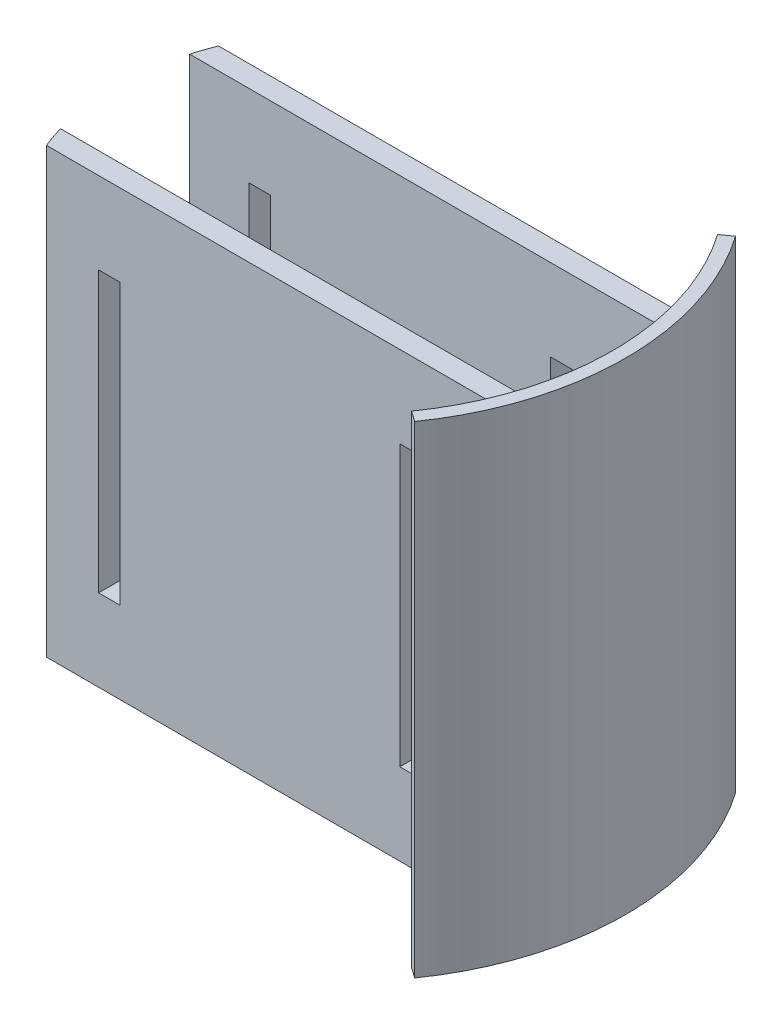
ISO-10303-21;
HEADER;
FILE_DESCRIPTION(('STEP AP214'),'2;1');
FILE_NAME('part.step','',(''),(''),'','','');
FILE_SCHEMA(('AUTOMOTIVE_DESIGN { 1 0 10303 214 1 1 1 1 }'));
ENDSEC;
DATA;
#1=APPLICATION_CONTEXT('core data for automotive mechanical design processes');
#2=APPLICATION_PROTOCOL_DEFINITION('international standard','automotive_design',2000,#1);
#3=PRODUCT_CONTEXT('',#1,'mechanical');
#4=PRODUCT('Part','Part','',(#3));
#5=PRODUCT_RELATED_PRODUCT_CATEGORY('part','',(#4));
#6=PRODUCT_DEFINITION_FORMATION('','',#4);
#7=PRODUCT_DEFINITION_CONTEXT('part definition',#1,'design');
#8=PRODUCT_DEFINITION('design','',#6,#7);
#9=PRODUCT_DEFINITION_SHAPE('','',#8);
#10=(LENGTH_UNIT() NAMED_UNIT(*) SI_UNIT(.MILLI.,.METRE.));
#11=(NAMED_UNIT(*) PLANE_ANGLE_UNIT() SI_UNIT($,.RADIAN.));
#12=(NAMED_UNIT(*) SI_UNIT($,.STERADIAN.) SOLID_ANGLE_UNIT());
#13=UNCERTAINTY_MEASURE_WITH_UNIT(LENGTH_MEASURE(1.E-05),#10,'distance_accuracy_value','');
#14=(GEOMETRIC_REPRESENTATION_CONTEXT(3) GLOBAL_UNCERTAINTY_ASSIGNED_CONTEXT((#13)) GLOBAL_UNIT_ASSIGNED_CONTEXT((#10,
#11,#12)) REPRESENTATION_CONTEXT('',''));
#15=CARTESIAN_POINT('',(0.,0.,0.));
#16=DIRECTION('',(0.,0.,1.));
#17=DIRECTION('',(1.,0.,0.));
#18=AXIS2_PLACEMENT_3D('',#15,#16,#17);
#19=CARTESIAN_POINT('',(0.,56.,0.));
#20=DIRECTION('',(0.,-1.,0.));
#21=DIRECTION('',(0.,0.,-1.));
#22=AXIS2_PLACEMENT_3D('',#19,#20,#21);
#23=CYLINDRICAL_SURFACE('',#22,62.);
#24=CARTESIAN_POINT('',(0.,-56.,0.));
#25=DIRECTION('',(0.,-1.,0.));
#26=DIRECTION('',(0.,0.,1.));
#27=AXIS2_PLACEMENT_3D('',#24,#25,#26);
#28=CIRCLE('',#27,62.);
#29=CARTESIAN_POINT('',(50.7874267459174,-56.,-35.561739053765));
#30=VERTEX_POINT('',#29);
#31=CARTESIAN_POINT('',(50.7874267459174,-56.,35.561739053765));
#32=VERTEX_POINT('',#31);
#33=EDGE_CURVE('E387',#30,#32,#28,.T.);
#34=ORIENTED_EDGE('',*,*,#33,.T.);
#35=DIRECTION('',(0.,-1.,0.));
#36=VECTOR('',#35,1.);
#37=CARTESIAN_POINT('',(50.7874267459174,56.,35.561739053765));
#38=LINE('',#37,#36);
#39=CARTESIAN_POINT('',(50.7874267459174,56.,35.561739053765));
#40=VERTEX_POINT('',#39);
#41=EDGE_CURVE('E414',#40,#32,#38,.T.);
#42=ORIENTED_EDGE('',*,*,#41,.F.);
#43=CARTESIAN_POINT('',(0.,56.,0.));
#44=DIRECTION('',(0.,-1.,0.));
#45=DIRECTION('',(0.,0.,1.));
#46=AXIS2_PLACEMENT_3D('',#43,#44,#45);
#47=CIRCLE('',#46,62.);
#48=CARTESIAN_POINT('',(50.7874267459174,56.,-35.561739053765));
#49=VERTEX_POINT('',#48);
#50=EDGE_CURVE('E388',#49,#40,#47,.T.);
#51=ORIENTED_EDGE('',*,*,#50,.F.);
#52=DIRECTION('',(0.,-1.,0.));
#53=VECTOR('',#52,1.);
#54=CARTESIAN_POINT('',(50.7874267459174,56.,-35.561739053765));
#55=LINE('',#54,#53);
#56=EDGE_CURVE('E398',#49,#30,#55,.T.);
#57=ORIENTED_EDGE('',*,*,#56,.T.);
#58=EDGE_LOOP('',(#34,#42,#51,#57));
#59=FACE_BOUND('',#58,.T.);
#60=DIRECTION('',(0.,-1.,0.));
#61=VECTOR('',#60,1.);
#62=CARTESIAN_POINT('',(58.6856030044848,51.5,-20.));
#63=LINE('',#62,#61);
#64=CARTESIAN_POINT('',(58.6856030044848,51.5,-20.));
#65=VERTEX_POINT('',#64);
#66=CARTESIAN_POINT('',(58.6856030044848,-51.5,-20.));
#67=VERTEX_POINT('',#66);
#68=EDGE_CURVE('E379',#65,#67,#63,.T.);
#69=ORIENTED_EDGE('',*,*,#68,.F.);
#70=CARTESIAN_POINT('',(0.,51.5,0.));
#71=DIRECTION('',(0.,1.,0.));
#72=DIRECTION('',(0.,0.,1.));
#73=AXIS2_PLACEMENT_3D('',#70,#71,#72);
#74=CIRCLE('',#73,62.);
#75=CARTESIAN_POINT('',(60.1581249707801,51.5,-15.));
#76=VERTEX_POINT('',#75);
#77=EDGE_CURVE('E363',#76,#65,#74,.T.);
#78=ORIENTED_EDGE('',*,*,#77,.F.);
#79=DIRECTION('',(0.,-1.,0.));
#80=VECTOR('',#79,1.);
#81=CARTESIAN_POINT('',(60.1581249707801,51.5,-15.));
#82=LINE('',#81,#80);
#83=CARTESIAN_POINT('',(60.1581249707801,-51.5,-15.));
#84=VERTEX_POINT('',#83);
#85=EDGE_CURVE('E382',#76,#84,#82,.T.);
#86=ORIENTED_EDGE('',*,*,#85,.T.);
#87=CARTESIAN_POINT('',(0.,-51.5,0.));
#88=DIRECTION('',(0.,1.,0.));
#89=DIRECTION('',(0.,0.,1.));
#90=AXIS2_PLACEMENT_3D('',#87,#88,#89);
#91=CIRCLE('',#90,62.);
#92=EDGE_CURVE('E374',#84,#67,#91,.T.);
#93=ORIENTED_EDGE('',*,*,#92,.T.);
#94=EDGE_LOOP('',(#69,#78,#86,#93));
#95=FACE_BOUND('',#94,.T.);
#96=CARTESIAN_POINT('',(0.,51.5,0.));
#97=DIRECTION('',(0.,1.,0.));
#98=DIRECTION('',(0.,0.,1.));
#99=AXIS2_PLACEMENT_3D('',#96,#97,#98);
#100=CIRCLE('',#99,62.);
#101=CARTESIAN_POINT('',(58.6856030044848,51.5,20.));
#102=VERTEX_POINT('',#101);
#103=CARTESIAN_POINT('',(60.1581249707801,51.5,15.));
#104=VERTEX_POINT('',#103);
#105=EDGE_CURVE('E350',#102,#104,#100,.T.);
#106=ORIENTED_EDGE('',*,*,#105,.F.);
#107=DIRECTION('',(0.,-1.,0.));
#108=VECTOR('',#107,1.);
#109=CARTESIAN_POINT('',(58.6856030044848,51.5,20.));
#110=LINE('',#109,#108);
#111=CARTESIAN_POINT('',(58.6856030044848,-51.5,20.));
#112=VERTEX_POINT('',#111);
#113=EDGE_CURVE('E327',#102,#112,#110,.T.);
#114=ORIENTED_EDGE('',*,*,#113,.T.);
#115=CARTESIAN_POINT('',(0.,-51.5,0.));
#116=DIRECTION('',(0.,1.,0.));
#117=DIRECTION('',(0.,0.,1.));
#118=AXIS2_PLACEMENT_3D('',#115,#116,#117);
#119=CIRCLE('',#118,62.);
#120=CARTESIAN_POINT('',(60.1581249707801,-51.5,15.));
#121=VERTEX_POINT('',#120);
#122=EDGE_CURVE('E339',#112,#121,#119,.T.);
#123=ORIENTED_EDGE('',*,*,#122,.T.);
#124=DIRECTION('',(0.,-1.,0.));
#125=VECTOR('',#124,1.);
#126=CARTESIAN_POINT('',(60.1581249707801,51.5,15.));
#127=LINE('',#126,#125);
#128=EDGE_CURVE('E330',#104,#121,#127,.T.);
#129=ORIENTED_EDGE('',*,*,#128,.F.);
#130=EDGE_LOOP('',(#106,#114,#123,#129));
#131=FACE_BOUND('',#130,.T.);
#132=ADVANCED_FACE('F37',(#59,#95,#131),#23,.F.);
#133=CARTESIAN_POINT('',(50.7874267459174,56.,35.561739053765));
#134=DIRECTION('',(0.573576436351047,0.,-0.819152044288991));
#135=DIRECTION('',(-0.819152044288991,0.,-0.573576436351047));
#136=AXIS2_PLACEMENT_3D('',#133,#134,#135);
#137=PLANE('',#136);
#138=DIRECTION('',(0.819152044288991,0.,0.573576436351047));
#139=VECTOR('',#138,1.);
#140=CARTESIAN_POINT('',(50.7874267459174,-56.,35.561739053765));
#141=LINE('',#140,#139);
#142=CARTESIAN_POINT('',(53.2448828787844,-56.,37.2824683628181));
#143=VERTEX_POINT('',#142);
#144=EDGE_CURVE('E401',#32,#143,#141,.T.);
#145=ORIENTED_EDGE('',*,*,#144,.T.);
#146=DIRECTION('',(0.,-1.,0.));
#147=VECTOR('',#146,1.);
#148=CARTESIAN_POINT('',(53.2448828787844,56.,37.2824683628181));
#149=LINE('',#148,#147);
#150=CARTESIAN_POINT('',(53.2448828787844,56.,37.2824683628181));
#151=VERTEX_POINT('',#150);
#152=EDGE_CURVE('E411',#151,#143,#149,.T.);
#153=ORIENTED_EDGE('',*,*,#152,.F.);
#154=DIRECTION('',(0.819152044288991,0.,0.573576436351047));
#155=VECTOR('',#154,1.);
#156=CARTESIAN_POINT('',(50.7874267459174,56.,35.561739053765));
#157=LINE('',#156,#155);
#158=EDGE_CURVE('E391',#40,#151,#157,.T.);
#159=ORIENTED_EDGE('',*,*,#158,.F.);
#160=ORIENTED_EDGE('',*,*,#41,.T.);
#161=EDGE_LOOP('',(#145,#153,#159,#160));
#162=FACE_BOUND('',#161,.T.);
#163=ADVANCED_FACE('F475',(#162),#137,.F.);
#164=CARTESIAN_POINT('',(0.,56.,0.));
#165=DIRECTION('',(0.,-1.,0.));
#166=DIRECTION('',(0.,0.,-1.));
#167=AXIS2_PLACEMENT_3D('',#164,#165,#166);
#168=CYLINDRICAL_SURFACE('',#167,65.);
#169=CARTESIAN_POINT('',(0.,-56.,0.));
#170=DIRECTION('',(0.,1.,0.));
#171=DIRECTION('',(0.,0.,1.));
#172=AXIS2_PLACEMENT_3D('',#169,#170,#171);
#173=CIRCLE('',#172,65.);
#174=CARTESIAN_POINT('',(53.2448828787844,-56.,-37.2824683628181));
#175=VERTEX_POINT('',#174);
#176=EDGE_CURVE('E403',#143,#175,#173,.T.);
#177=ORIENTED_EDGE('',*,*,#176,.T.);
#178=DIRECTION('',(0.,-1.,0.));
#179=VECTOR('',#178,1.);
#180=CARTESIAN_POINT('',(53.2448828787844,56.,-37.2824683628181));
#181=LINE('',#180,#179);
#182=CARTESIAN_POINT('',(53.2448828787844,56.,-37.2824683628181));
#183=VERTEX_POINT('',#182);
#184=EDGE_CURVE('E408',#183,#175,#181,.T.);
#185=ORIENTED_EDGE('',*,*,#184,.F.);
#186=CARTESIAN_POINT('',(0.,56.,0.));
#187=DIRECTION('',(0.,1.,0.));
#188=DIRECTION('',(0.,0.,1.));
#189=AXIS2_PLACEMENT_3D('',#186,#187,#188);
#190=CIRCLE('',#189,65.);
#191=EDGE_CURVE('E394',#151,#183,#190,.T.);
#192=ORIENTED_EDGE('',*,*,#191,.F.);
#193=ORIENTED_EDGE('',*,*,#152,.T.);
#194=EDGE_LOOP('',(#177,#185,#192,#193));
#195=FACE_BOUND('',#194,.T.);
#196=ADVANCED_FACE('F480',(#195),#168,.T.);
#197=CARTESIAN_POINT('',(50.7874267459174,56.,-35.561739053765));
#198=DIRECTION('',(0.573576436351044,0.,0.819152044288993));
#199=DIRECTION('',(0.819152044288993,0.,-0.573576436351044));
#200=AXIS2_PLACEMENT_3D('',#197,#198,#199);
#201=PLANE('',#200);
#202=DIRECTION('',(-0.819152044288993,0.,0.573576436351044));
#203=VECTOR('',#202,1.);
#204=CARTESIAN_POINT('',(50.7874267459174,-56.,-35.561739053765));
#205=LINE('',#204,#203);
#206=EDGE_CURVE('E392',#175,#30,#205,.T.);
#207=ORIENTED_EDGE('',*,*,#206,.T.);
#208=ORIENTED_EDGE('',*,*,#56,.F.);
#209=DIRECTION('',(-0.819152044288993,0.,0.573576436351044));
#210=VECTOR('',#209,1.);
#211=CARTESIAN_POINT('',(50.7874267459174,56.,-35.561739053765));
#212=LINE('',#211,#210);
#213=EDGE_CURVE('E396',#183,#49,#212,.T.);
#214=ORIENTED_EDGE('',*,*,#213,.F.);
#215=ORIENTED_EDGE('',*,*,#184,.T.);
#216=EDGE_LOOP('',(#207,#208,#214,#215));
#217=FACE_BOUND('',#216,.T.);
#218=ADVANCED_FACE('F537',(#217),#201,.F.);
#219=CARTESIAN_POINT('',(0.,56.,0.));
#220=DIRECTION('',(0.,1.,0.));
#221=DIRECTION('',(0.,0.,1.));
#222=AXIS2_PLACEMENT_3D('',#219,#220,#221);
#223=PLANE('',#222);
#224=ORIENTED_EDGE('',*,*,#50,.T.);
#225=ORIENTED_EDGE('',*,*,#158,.T.);
#226=ORIENTED_EDGE('',*,*,#191,.T.);
#227=ORIENTED_EDGE('',*,*,#213,.T.);
#228=EDGE_LOOP('',(#224,#225,#226,#227));
#229=FACE_BOUND('',#228,.T.);
#230=ADVANCED_FACE('F534',(#229),#223,.T.);
#231=CARTESIAN_POINT('',(0.,-56.,0.));
#232=DIRECTION('',(0.,1.,0.));
#233=DIRECTION('',(0.,0.,1.));
#234=AXIS2_PLACEMENT_3D('',#231,#232,#233);
#235=PLANE('',#234);
#236=ORIENTED_EDGE('',*,*,#33,.F.);
#237=ORIENTED_EDGE('',*,*,#206,.F.);
#238=ORIENTED_EDGE('',*,*,#176,.F.);
#239=ORIENTED_EDGE('',*,*,#144,.F.);
#240=EDGE_LOOP('',(#236,#237,#238,#239));
#241=FACE_BOUND('',#240,.T.);
#242=ADVANCED_FACE('F532',(#241),#235,.F.);
#243=CARTESIAN_POINT('',(0.,51.5,0.));
#244=DIRECTION('',(0.,-1.,0.));
#245=DIRECTION('',(0.,0.,-1.));
#246=AXIS2_PLACEMENT_3D('',#243,#244,#245);
#247=CYLINDRICAL_SURFACE('',#246,53.5);
#248=CARTESIAN_POINT('',(0.,-51.5,0.));
#249=DIRECTION('',(0.,1.,0.));
#250=DIRECTION('',(0.,0.,1.));
#251=AXIS2_PLACEMENT_3D('',#248,#249,#250);
#252=CIRCLE('',#251,53.5);
#253=CARTESIAN_POINT('',(-49.6210640756524,-51.5,-20.));
#254=VERTEX_POINT('',#253);
#255=CARTESIAN_POINT('',(-51.3541624408382,-51.5,-15.));
#256=VERTEX_POINT('',#255);
#257=EDGE_CURVE('E348',#254,#256,#252,.T.);
#258=ORIENTED_EDGE('',*,*,#257,.T.);
#259=DIRECTION('',(0.,-1.,0.));
#260=VECTOR('',#259,1.);
#261=CARTESIAN_POINT('',(-51.3541624408382,51.5,-15.));
#262=LINE('',#261,#260);
#263=CARTESIAN_POINT('',(-51.3541624408382,51.5,-15.));
#264=VERTEX_POINT('',#263);
#265=EDGE_CURVE('E384',#264,#256,#262,.T.);
#266=ORIENTED_EDGE('',*,*,#265,.F.);
#267=CARTESIAN_POINT('',(0.,51.5,0.));
#268=DIRECTION('',(0.,1.,0.));
#269=DIRECTION('',(0.,0.,1.));
#270=AXIS2_PLACEMENT_3D('',#267,#268,#269);
#271=CIRCLE('',#270,53.5);
#272=CARTESIAN_POINT('',(-49.6210640756524,51.5,-20.));
#273=VERTEX_POINT('',#272);
#274=EDGE_CURVE('E356',#273,#264,#271,.T.);
#275=ORIENTED_EDGE('',*,*,#274,.F.);
#276=DIRECTION('',(0.,-1.,0.));
#277=VECTOR('',#276,1.);
#278=CARTESIAN_POINT('',(-49.6210640756524,51.5,-20.));
#279=LINE('',#278,#277);
#280=EDGE_CURVE('E368',#273,#254,#279,.T.);
#281=ORIENTED_EDGE('',*,*,#280,.T.);
#282=EDGE_LOOP('',(#258,#266,#275,#281));
#283=FACE_BOUND('',#282,.T.);
#284=ADVANCED_FACE('F529',(#283),#247,.T.);
#285=CARTESIAN_POINT('',(-51.3541624408382,51.5,-15.));
#286=DIRECTION('',(0.,0.,-1.));
#287=DIRECTION('',(-1.,0.,0.));
#288=AXIS2_PLACEMENT_3D('',#285,#286,#287);
#289=PLANE('',#288);
#290=DIRECTION('',(1.,0.,0.));
#291=VECTOR('',#290,1.);
#292=CARTESIAN_POINT('',(-51.3541624408382,32.5,-15.));
#293=LINE('',#292,#291);
#294=CARTESIAN_POINT('',(-37.5,32.5,-15.));
#295=VERTEX_POINT('',#294);
#296=CARTESIAN_POINT('',(-32.5,32.5,-15.));
#297=VERTEX_POINT('',#296);
#298=EDGE_CURVE('E312',#295,#297,#293,.T.);
#299=ORIENTED_EDGE('',*,*,#298,.T.);
#300=DIRECTION('',(0.,-1.,0.));
#301=VECTOR('',#300,1.);
#302=CARTESIAN_POINT('',(-32.5,51.5,-15.));
#303=LINE('',#302,#301);
#304=CARTESIAN_POINT('',(-32.5,-32.5,-15.));
#305=VERTEX_POINT('',#304);
#306=EDGE_CURVE('E321',#297,#305,#303,.T.);
#307=ORIENTED_EDGE('',*,*,#306,.T.);
#308=DIRECTION('',(-1.,0.,0.));
#309=VECTOR('',#308,1.);
#310=CARTESIAN_POINT('',(-51.3541624408384,-32.5,-15.));
#311=LINE('',#310,#309);
#312=CARTESIAN_POINT('',(-37.5,-32.5,-15.));
#313=VERTEX_POINT('',#312);
#314=EDGE_CURVE('E318',#305,#313,#311,.T.);
#315=ORIENTED_EDGE('',*,*,#314,.T.);
#316=DIRECTION('',(0.,1.,0.));
#317=VECTOR('',#316,1.);
#318=CARTESIAN_POINT('',(-37.5,51.5,-15.));
#319=LINE('',#318,#317);
#320=EDGE_CURVE('E315',#313,#295,#319,.T.);
#321=ORIENTED_EDGE('',*,*,#320,.T.);
#322=EDGE_LOOP('',(#299,#307,#315,#321));
#323=FACE_BOUND('',#322,.T.);
#324=DIRECTION('',(1.,0.,0.));
#325=VECTOR('',#324,1.);
#326=CARTESIAN_POINT('',(-51.3541624408382,32.5,-15.));
#327=LINE('',#326,#325);
#328=CARTESIAN_POINT('',(32.5,32.5,-15.));
#329=VERTEX_POINT('',#328);
#330=CARTESIAN_POINT('',(37.5,32.5,-15.));
#331=VERTEX_POINT('',#330);
#332=EDGE_CURVE('E265',#329,#331,#327,.T.);
#333=ORIENTED_EDGE('',*,*,#332,.T.);
#334=DIRECTION('',(0.,-1.,0.));
#335=VECTOR('',#334,1.);
#336=CARTESIAN_POINT('',(37.5,51.5,-15.));
#337=LINE('',#336,#335);
#338=CARTESIAN_POINT('',(37.5,-32.5,-15.));
#339=VERTEX_POINT('',#338);
#340=EDGE_CURVE('E309',#331,#339,#337,.T.);
#341=ORIENTED_EDGE('',*,*,#340,.T.);
#342=DIRECTION('',(-1.,0.,0.));
#343=VECTOR('',#342,1.);
#344=CARTESIAN_POINT('',(-51.3541624408381,-32.5000000000001,-15.));
#345=LINE('',#344,#343);
#346=CARTESIAN_POINT('',(32.5,-32.5,-15.));
#347=VERTEX_POINT('',#346);
#348=EDGE_CURVE('E306',#339,#347,#345,.T.);
#349=ORIENTED_EDGE('',*,*,#348,.T.);
#350=DIRECTION('',(0.,1.,0.));
#351=VECTOR('',#350,1.);
#352=CARTESIAN_POINT('',(32.5,51.5,-15.));
#353=LINE('',#352,#351);
#354=EDGE_CURVE('E303',#347,#329,#353,.T.);
#355=ORIENTED_EDGE('',*,*,#354,.T.);
#356=EDGE_LOOP('',(#333,#341,#349,#355));
#357=FACE_BOUND('',#356,.T.);
#358=DIRECTION('',(1.,0.,0.));
#359=VECTOR('',#358,1.);
#360=CARTESIAN_POINT('',(-51.3541624408382,-51.5,-15.));
#361=LINE('',#360,#359);
#362=EDGE_CURVE('E371',#256,#84,#361,.T.);
#363=ORIENTED_EDGE('',*,*,#362,.T.);
#364=ORIENTED_EDGE('',*,*,#85,.F.);
#365=DIRECTION('',(1.,0.,0.));
#366=VECTOR('',#365,1.);
#367=CARTESIAN_POINT('',(-51.3541624408382,51.5,-15.));
#368=LINE('',#367,#366);
#369=EDGE_CURVE('E359',#264,#76,#368,.T.);
#370=ORIENTED_EDGE('',*,*,#369,.F.);
#371=ORIENTED_EDGE('',*,*,#265,.T.);
#372=EDGE_LOOP('',(#363,#364,#370,#371));
#373=FACE_BOUND('',#372,.T.);
#374=ADVANCED_FACE('F460',(#323,#357,#373),#289,.F.);
#375=CARTESIAN_POINT('',(-49.6210640756524,51.5,-20.));
#376=DIRECTION('',(0.,0.,1.));
#377=DIRECTION('',(1.,0.,0.));
#378=AXIS2_PLACEMENT_3D('',#375,#376,#377);
#379=PLANE('',#378);
#380=DIRECTION('',(-1.,0.,0.));
#381=VECTOR('',#380,1.);
#382=CARTESIAN_POINT('',(-37.5,-32.5,-20.));
#383=LINE('',#382,#381);
#384=CARTESIAN_POINT('',(-32.5,-32.5,-20.));
#385=VERTEX_POINT('',#384);
#386=CARTESIAN_POINT('',(-37.5,-32.5,-20.));
#387=VERTEX_POINT('',#386);
#388=EDGE_CURVE('E442',#385,#387,#383,.T.);
#389=ORIENTED_EDGE('',*,*,#388,.F.);
#390=DIRECTION('',(0.,-1.,0.));
#391=VECTOR('',#390,1.);
#392=CARTESIAN_POINT('',(-32.5,-32.5,-20.));
#393=LINE('',#392,#391);
#394=CARTESIAN_POINT('',(-32.5,32.5,-20.));
#395=VERTEX_POINT('',#394);
#396=EDGE_CURVE('E266',#395,#385,#393,.T.);
#397=ORIENTED_EDGE('',*,*,#396,.F.);
#398=DIRECTION('',(1.,0.,0.));
#399=VECTOR('',#398,1.);
#400=CARTESIAN_POINT('',(-37.5,32.5,-20.));
#401=LINE('',#400,#399);
#402=CARTESIAN_POINT('',(-37.5,32.5,-20.));
#403=VERTEX_POINT('',#402);
#404=EDGE_CURVE('E263',#403,#395,#401,.T.);
#405=ORIENTED_EDGE('',*,*,#404,.F.);
#406=DIRECTION('',(0.,1.,0.));
#407=VECTOR('',#406,1.);
#408=CARTESIAN_POINT('',(-37.5,-32.5,-20.));
#409=LINE('',#408,#407);
#410=EDGE_CURVE('E255',#387,#403,#409,.T.);
#411=ORIENTED_EDGE('',*,*,#410,.F.);
#412=EDGE_LOOP('',(#389,#397,#405,#411));
#413=FACE_BOUND('',#412,.T.);
#414=DIRECTION('',(-1.,0.,0.));
#415=VECTOR('',#414,1.);
#416=CARTESIAN_POINT('',(37.5,-32.5,-20.));
#417=LINE('',#416,#415);
#418=CARTESIAN_POINT('',(37.5,-32.5,-20.));
#419=VERTEX_POINT('',#418);
#420=CARTESIAN_POINT('',(32.5,-32.5,-20.));
#421=VERTEX_POINT('',#420);
#422=EDGE_CURVE('E296',#419,#421,#417,.T.);
#423=ORIENTED_EDGE('',*,*,#422,.F.);
#424=DIRECTION('',(0.,-1.,0.));
#425=VECTOR('',#424,1.);
#426=CARTESIAN_POINT('',(37.5,-32.5,-20.));
#427=LINE('',#426,#425);
#428=CARTESIAN_POINT('',(37.5,32.5,-20.));
#429=VERTEX_POINT('',#428);
#430=EDGE_CURVE('E269',#429,#419,#427,.T.);
#431=ORIENTED_EDGE('',*,*,#430,.F.);
#432=DIRECTION('',(1.,0.,0.));
#433=VECTOR('',#432,1.);
#434=CARTESIAN_POINT('',(37.5,32.5,-20.));
#435=LINE('',#434,#433);
#436=CARTESIAN_POINT('',(32.5,32.5,-20.));
#437=VERTEX_POINT('',#436);
#438=EDGE_CURVE('E267',#437,#429,#435,.T.);
#439=ORIENTED_EDGE('',*,*,#438,.F.);
#440=DIRECTION('',(0.,1.,0.));
#441=VECTOR('',#440,1.);
#442=CARTESIAN_POINT('',(32.5,-32.5,-20.));
#443=LINE('',#442,#441);
#444=EDGE_CURVE('E298',#421,#437,#443,.T.);
#445=ORIENTED_EDGE('',*,*,#444,.F.);
#446=EDGE_LOOP('',(#423,#431,#439,#445));
#447=FACE_BOUND('',#446,.T.);
#448=DIRECTION('',(-1.,0.,0.));
#449=VECTOR('',#448,1.);
#450=CARTESIAN_POINT('',(-49.6210640756524,-51.5,-20.));
#451=LINE('',#450,#449);
#452=EDGE_CURVE('E360',#67,#254,#451,.T.);
#453=ORIENTED_EDGE('',*,*,#452,.T.);
#454=ORIENTED_EDGE('',*,*,#280,.F.);
#455=DIRECTION('',(-1.,0.,0.));
#456=VECTOR('',#455,1.);
#457=CARTESIAN_POINT('',(-49.6210640756524,51.5,-20.));
#458=LINE('',#457,#456);
#459=EDGE_CURVE('E366',#65,#273,#458,.T.);
#460=ORIENTED_EDGE('',*,*,#459,.F.);
#461=ORIENTED_EDGE('',*,*,#68,.T.);
#462=EDGE_LOOP('',(#453,#454,#460,#461));
#463=FACE_BOUND('',#462,.T.);
#464=ADVANCED_FACE('F453',(#413,#447,#463),#379,.F.);
#465=CARTESIAN_POINT('',(0.,51.5,0.));
#466=DIRECTION('',(0.,1.,0.));
#467=DIRECTION('',(0.,0.,1.));
#468=AXIS2_PLACEMENT_3D('',#465,#466,#467);
#469=PLANE('',#468);
#470=ORIENTED_EDGE('',*,*,#274,.T.);
#471=ORIENTED_EDGE('',*,*,#369,.T.);
#472=ORIENTED_EDGE('',*,*,#77,.T.);
#473=ORIENTED_EDGE('',*,*,#459,.T.);
#474=EDGE_LOOP('',(#470,#471,#472,#473));
#475=FACE_BOUND('',#474,.T.);
#476=ADVANCED_FACE('F517',(#475),#469,.T.);
#477=CARTESIAN_POINT('',(0.,-51.5,0.));
#478=DIRECTION('',(0.,1.,0.));
#479=DIRECTION('',(0.,0.,1.));
#480=AXIS2_PLACEMENT_3D('',#477,#478,#479);
#481=PLANE('',#480);
#482=ORIENTED_EDGE('',*,*,#257,.F.);
#483=ORIENTED_EDGE('',*,*,#452,.F.);
#484=ORIENTED_EDGE('',*,*,#92,.F.);
#485=ORIENTED_EDGE('',*,*,#362,.F.);
#486=EDGE_LOOP('',(#482,#483,#484,#485));
#487=FACE_BOUND('',#486,.T.);
#488=ADVANCED_FACE('F520',(#487),#481,.F.);
#489=CARTESIAN_POINT('',(0.,51.5,0.));
#490=DIRECTION('',(0.,-1.,0.));
#491=DIRECTION('',(0.,0.,-1.));
#492=AXIS2_PLACEMENT_3D('',#489,#490,#491);
#493=CYLINDRICAL_SURFACE('',#492,53.5);
#494=CARTESIAN_POINT('',(0.,-51.5,0.));
#495=DIRECTION('',(0.,1.,0.));
#496=DIRECTION('',(0.,0.,-1.));
#497=AXIS2_PLACEMENT_3D('',#494,#495,#496);
#498=CIRCLE('',#497,53.5);
#499=CARTESIAN_POINT('',(-51.3541624408382,-51.5,15.));
#500=VERTEX_POINT('',#499);
#501=CARTESIAN_POINT('',(-49.6210640756524,-51.5,20.));
#502=VERTEX_POINT('',#501);
#503=EDGE_CURVE('E345',#500,#502,#498,.T.);
#504=ORIENTED_EDGE('',*,*,#503,.T.);
#505=DIRECTION('',(0.,-1.,0.));
#506=VECTOR('',#505,1.);
#507=CARTESIAN_POINT('',(-49.6210640756524,51.5,20.));
#508=LINE('',#507,#506);
#509=CARTESIAN_POINT('',(-49.6210640756524,51.5,20.));
#510=VERTEX_POINT('',#509);
#511=EDGE_CURVE('E324',#510,#502,#508,.T.);
#512=ORIENTED_EDGE('',*,*,#511,.F.);
#513=CARTESIAN_POINT('',(0.,51.5,0.));
#514=DIRECTION('',(0.,1.,0.));
#515=DIRECTION('',(0.,0.,-1.));
#516=AXIS2_PLACEMENT_3D('',#513,#514,#515);
#517=CIRCLE('',#516,53.5);
#518=CARTESIAN_POINT('',(-51.3541624408382,51.5,15.));
#519=VERTEX_POINT('',#518);
#520=EDGE_CURVE('E340',#519,#510,#517,.T.);
#521=ORIENTED_EDGE('',*,*,#520,.F.);
#522=DIRECTION('',(0.,-1.,0.));
#523=VECTOR('',#522,1.);
#524=CARTESIAN_POINT('',(-51.3541624408382,51.5,15.));
#525=LINE('',#524,#523);
#526=EDGE_CURVE('E333',#519,#500,#525,.T.);
#527=ORIENTED_EDGE('',*,*,#526,.T.);
#528=EDGE_LOOP('',(#504,#512,#521,#527));
#529=FACE_BOUND('',#528,.T.);
#530=ADVANCED_FACE('F498',(#529),#493,.T.);
#531=CARTESIAN_POINT('',(-49.6210640756524,51.5,20.));
#532=DIRECTION('',(0.,0.,-1.));
#533=DIRECTION('',(-1.,0.,0.));
#534=AXIS2_PLACEMENT_3D('',#531,#532,#533);
#535=PLANE('',#534);
#536=DIRECTION('',(-1.,0.,0.));
#537=VECTOR('',#536,1.);
#538=CARTESIAN_POINT('',(-37.5,32.5,20.));
#539=LINE('',#538,#537);
#540=CARTESIAN_POINT('',(-32.5,32.5,20.));
#541=VERTEX_POINT('',#540);
#542=CARTESIAN_POINT('',(-37.5,32.5,20.));
#543=VERTEX_POINT('',#542);
#544=EDGE_CURVE('E236',#541,#543,#539,.T.);
#545=ORIENTED_EDGE('',*,*,#544,.F.);
#546=DIRECTION('',(0.,1.,0.));
#547=VECTOR('',#546,1.);
#548=CARTESIAN_POINT('',(-32.5,-32.5,20.));
#549=LINE('',#548,#547);
#550=CARTESIAN_POINT('',(-32.5,-32.5,20.));
#551=VERTEX_POINT('',#550);
#552=EDGE_CURVE('E242',#551,#541,#549,.T.);
#553=ORIENTED_EDGE('',*,*,#552,.F.);
#554=DIRECTION('',(1.,0.,0.));
#555=VECTOR('',#554,1.);
#556=CARTESIAN_POINT('',(-37.5,-32.5,20.));
#557=LINE('',#556,#555);
#558=CARTESIAN_POINT('',(-37.5,-32.5,20.));
#559=VERTEX_POINT('',#558);
#560=EDGE_CURVE('E247',#559,#551,#557,.T.);
#561=ORIENTED_EDGE('',*,*,#560,.F.);
#562=DIRECTION('',(0.,-1.,0.));
#563=VECTOR('',#562,1.);
#564=CARTESIAN_POINT('',(-37.5,-32.5,20.));
#565=LINE('',#564,#563);
#566=EDGE_CURVE('E226',#543,#559,#565,.T.);
#567=ORIENTED_EDGE('',*,*,#566,.F.);
#568=EDGE_LOOP('',(#545,#553,#561,#567));
#569=FACE_BOUND('',#568,.T.);
#570=DIRECTION('',(-1.,0.,0.));
#571=VECTOR('',#570,1.);
#572=CARTESIAN_POINT('',(37.5,32.5,20.));
#573=LINE('',#572,#571);
#574=CARTESIAN_POINT('',(37.5,32.5,20.));
#575=VERTEX_POINT('',#574);
#576=CARTESIAN_POINT('',(32.5,32.5,20.));
#577=VERTEX_POINT('',#576);
#578=EDGE_CURVE('E290',#575,#577,#573,.T.);
#579=ORIENTED_EDGE('',*,*,#578,.F.);
#580=DIRECTION('',(0.,1.,0.));
#581=VECTOR('',#580,1.);
#582=CARTESIAN_POINT('',(37.5,-32.5,20.));
#583=LINE('',#582,#581);
#584=CARTESIAN_POINT('',(37.5,-32.5,20.));
#585=VERTEX_POINT('',#584);
#586=EDGE_CURVE('E293',#585,#575,#583,.T.);
#587=ORIENTED_EDGE('',*,*,#586,.F.);
#588=DIRECTION('',(1.,0.,0.));
#589=VECTOR('',#588,1.);
#590=CARTESIAN_POINT('',(37.5,-32.5,20.));
#591=LINE('',#590,#589);
#592=CARTESIAN_POINT('',(32.5,-32.5,20.));
#593=VERTEX_POINT('',#592);
#594=EDGE_CURVE('E271',#593,#585,#591,.T.);
#595=ORIENTED_EDGE('',*,*,#594,.F.);
#596=DIRECTION('',(0.,-1.,0.));
#597=VECTOR('',#596,1.);
#598=CARTESIAN_POINT('',(32.5,-32.5,20.));
#599=LINE('',#598,#597);
#600=EDGE_CURVE('E287',#577,#593,#599,.T.);
#601=ORIENTED_EDGE('',*,*,#600,.F.);
#602=EDGE_LOOP('',(#579,#587,#595,#601));
#603=FACE_BOUND('',#602,.T.);
#604=DIRECTION('',(1.,0.,0.));
#605=VECTOR('',#604,1.);
#606=CARTESIAN_POINT('',(-49.6210640756524,-51.5,20.));
#607=LINE('',#606,#605);
#608=EDGE_CURVE('E343',#502,#112,#607,.T.);
#609=ORIENTED_EDGE('',*,*,#608,.T.);
#610=ORIENTED_EDGE('',*,*,#113,.F.);
#611=DIRECTION('',(1.,0.,0.));
#612=VECTOR('',#611,1.);
#613=CARTESIAN_POINT('',(-49.6210640756524,51.5,20.));
#614=LINE('',#613,#612);
#615=EDGE_CURVE('E352',#510,#102,#614,.T.);
#616=ORIENTED_EDGE('',*,*,#615,.F.);
#617=ORIENTED_EDGE('',*,*,#511,.T.);
#618=EDGE_LOOP('',(#609,#610,#616,#617));
#619=FACE_BOUND('',#618,.T.);
#620=ADVANCED_FACE('F244',(#569,#603,#619),#535,.F.);
#621=CARTESIAN_POINT('',(-51.3541624408382,51.5,15.));
#622=DIRECTION('',(0.,0.,1.));
#623=DIRECTION('',(1.,0.,0.));
#624=AXIS2_PLACEMENT_3D('',#621,#622,#623);
#625=PLANE('',#624);
#626=DIRECTION('',(1.,0.,0.));
#627=VECTOR('',#626,1.);
#628=CARTESIAN_POINT('',(-51.3541624408384,-32.5,15.));
#629=LINE('',#628,#627);
#630=CARTESIAN_POINT('',(-37.5,-32.5,15.));
#631=VERTEX_POINT('',#630);
#632=CARTESIAN_POINT('',(-32.5,-32.5,15.));
#633=VERTEX_POINT('',#632);
#634=EDGE_CURVE('E44',#631,#633,#629,.T.);
#635=ORIENTED_EDGE('',*,*,#634,.T.);
#636=DIRECTION('',(0.,1.,0.));
#637=VECTOR('',#636,1.);
#638=CARTESIAN_POINT('',(-32.5,51.5,15.));
#639=LINE('',#638,#637);
#640=CARTESIAN_POINT('',(-32.5,32.5,15.));
#641=VERTEX_POINT('',#640);
#642=EDGE_CURVE('E11',#633,#641,#639,.T.);
#643=ORIENTED_EDGE('',*,*,#642,.T.);
#644=DIRECTION('',(-1.,0.,0.));
#645=VECTOR('',#644,1.);
#646=CARTESIAN_POINT('',(-51.3541624408382,32.5,15.));
#647=LINE('',#646,#645);
#648=CARTESIAN_POINT('',(-37.5,32.5,15.));
#649=VERTEX_POINT('',#648);
#650=EDGE_CURVE('E429',#641,#649,#647,.T.);
#651=ORIENTED_EDGE('',*,*,#650,.T.);
#652=DIRECTION('',(0.,-1.,0.));
#653=VECTOR('',#652,1.);
#654=CARTESIAN_POINT('',(-37.5,51.5,15.));
#655=LINE('',#654,#653);
#656=EDGE_CURVE('E229',#649,#631,#655,.T.);
#657=ORIENTED_EDGE('',*,*,#656,.T.);
#658=EDGE_LOOP('',(#635,#643,#651,#657));
#659=FACE_BOUND('',#658,.T.);
#660=DIRECTION('',(1.,0.,0.));
#661=VECTOR('',#660,1.);
#662=CARTESIAN_POINT('',(-51.3541624408381,-32.5000000000001,15.));
#663=LINE('',#662,#661);
#664=CARTESIAN_POINT('',(32.5,-32.5,15.));
#665=VERTEX_POINT('',#664);
#666=CARTESIAN_POINT('',(37.5,-32.5,15.));
#667=VERTEX_POINT('',#666);
#668=EDGE_CURVE('E423',#665,#667,#663,.T.);
#669=ORIENTED_EDGE('',*,*,#668,.T.);
#670=DIRECTION('',(0.,1.,0.));
#671=VECTOR('',#670,1.);
#672=CARTESIAN_POINT('',(37.5,51.5,15.));
#673=LINE('',#672,#671);
#674=CARTESIAN_POINT('',(37.5,32.5,15.));
#675=VERTEX_POINT('',#674);
#676=EDGE_CURVE('E426',#667,#675,#673,.T.);
#677=ORIENTED_EDGE('',*,*,#676,.T.);
#678=DIRECTION('',(-1.,0.,0.));
#679=VECTOR('',#678,1.);
#680=CARTESIAN_POINT('',(-51.3541624408382,32.5,15.));
#681=LINE('',#680,#679);
#682=CARTESIAN_POINT('',(32.5,32.5,15.));
#683=VERTEX_POINT('',#682);
#684=EDGE_CURVE('E417',#675,#683,#681,.T.);
#685=ORIENTED_EDGE('',*,*,#684,.T.);
#686=DIRECTION('',(0.,-1.,0.));
#687=VECTOR('',#686,1.);
#688=CARTESIAN_POINT('',(32.5,51.5,15.));
#689=LINE('',#688,#687);
#690=EDGE_CURVE('E420',#683,#665,#689,.T.);
#691=ORIENTED_EDGE('',*,*,#690,.T.);
#692=EDGE_LOOP('',(#669,#677,#685,#691));
#693=FACE_BOUND('',#692,.T.);
#694=DIRECTION('',(-1.,0.,0.));
#695=VECTOR('',#694,1.);
#696=CARTESIAN_POINT('',(-51.3541624408382,-51.5,15.));
#697=LINE('',#696,#695);
#698=EDGE_CURVE('E337',#121,#500,#697,.T.);
#699=ORIENTED_EDGE('',*,*,#698,.T.);
#700=ORIENTED_EDGE('',*,*,#526,.F.);
#701=DIRECTION('',(-1.,0.,0.));
#702=VECTOR('',#701,1.);
#703=CARTESIAN_POINT('',(-51.3541624408382,51.5,15.));
#704=LINE('',#703,#702);
#705=EDGE_CURVE('E336',#104,#519,#704,.T.);
#706=ORIENTED_EDGE('',*,*,#705,.F.);
#707=ORIENTED_EDGE('',*,*,#128,.T.);
#708=EDGE_LOOP('',(#699,#700,#706,#707));
#709=FACE_BOUND('',#708,.T.);
#710=ADVANCED_FACE('F433',(#659,#693,#709),#625,.F.);
#711=CARTESIAN_POINT('',(0.,51.5,0.));
#712=DIRECTION('',(0.,-1.,0.));
#713=DIRECTION('',(0.,0.,-1.));
#714=AXIS2_PLACEMENT_3D('',#711,#712,#713);
#715=PLANE('',#714);
#716=ORIENTED_EDGE('',*,*,#520,.T.);
#717=ORIENTED_EDGE('',*,*,#615,.T.);
#718=ORIENTED_EDGE('',*,*,#105,.T.);
#719=ORIENTED_EDGE('',*,*,#705,.T.);
#720=EDGE_LOOP('',(#716,#717,#718,#719));
#721=FACE_BOUND('',#720,.T.);
#722=ADVANCED_FACE('F491',(#721),#715,.F.);
#723=CARTESIAN_POINT('',(0.,-51.5,0.));
#724=DIRECTION('',(0.,-1.,0.));
#725=DIRECTION('',(0.,0.,-1.));
#726=AXIS2_PLACEMENT_3D('',#723,#724,#725);
#727=PLANE('',#726);
#728=ORIENTED_EDGE('',*,*,#503,.F.);
#729=ORIENTED_EDGE('',*,*,#698,.F.);
#730=ORIENTED_EDGE('',*,*,#122,.F.);
#731=ORIENTED_EDGE('',*,*,#608,.F.);
#732=EDGE_LOOP('',(#728,#729,#730,#731));
#733=FACE_BOUND('',#732,.T.);
#734=ADVANCED_FACE('F502',(#733),#727,.T.);
#735=CARTESIAN_POINT('',(37.5,32.5,-85.1920240520265));
#736=DIRECTION('',(0.,1.,0.));
#737=DIRECTION('',(0.,0.,1.));
#738=AXIS2_PLACEMENT_3D('',#735,#736,#737);
#739=PLANE('',#738);
#740=DIRECTION('',(0.,0.,1.));
#741=VECTOR('',#740,1.);
#742=CARTESIAN_POINT('',(37.5,32.5,-85.1920240520265));
#743=LINE('',#742,#741);
#744=EDGE_CURVE('E272',#675,#575,#743,.T.);
#745=ORIENTED_EDGE('',*,*,#744,.T.);
#746=ORIENTED_EDGE('',*,*,#578,.T.);
#747=DIRECTION('',(0.,0.,1.));
#748=VECTOR('',#747,1.);
#749=CARTESIAN_POINT('',(32.5,32.5,-85.1920240520265));
#750=LINE('',#749,#748);
#751=EDGE_CURVE('E276',#683,#577,#750,.T.);
#752=ORIENTED_EDGE('',*,*,#751,.F.);
#753=ORIENTED_EDGE('',*,*,#684,.F.);
#754=EDGE_LOOP('',(#745,#746,#752,#753));
#755=FACE_BOUND('',#754,.T.);
#756=ADVANCED_FACE('F504',(#755),#739,.F.);
#757=CARTESIAN_POINT('',(32.5,-32.5,-85.1920240520265));
#758=DIRECTION('',(-1.,0.,0.));
#759=DIRECTION('',(0.,-1.,0.));
#760=AXIS2_PLACEMENT_3D('',#757,#758,#759);
#761=PLANE('',#760);
#762=ORIENTED_EDGE('',*,*,#751,.T.);
#763=ORIENTED_EDGE('',*,*,#600,.T.);
#764=DIRECTION('',(0.,0.,1.));
#765=VECTOR('',#764,1.);
#766=CARTESIAN_POINT('',(32.5,-32.5,-85.1920240520265));
#767=LINE('',#766,#765);
#768=EDGE_CURVE('E280',#665,#593,#767,.T.);
#769=ORIENTED_EDGE('',*,*,#768,.F.);
#770=ORIENTED_EDGE('',*,*,#690,.F.);
#771=EDGE_LOOP('',(#762,#763,#769,#770));
#772=FACE_BOUND('',#771,.T.);
#773=ADVANCED_FACE('F510',(#772),#761,.F.);
#774=CARTESIAN_POINT('',(37.5,-32.5,-85.1920240520265));
#775=DIRECTION('',(0.,-1.,0.));
#776=DIRECTION('',(1.,0.,0.));
#777=AXIS2_PLACEMENT_3D('',#774,#775,#776);
#778=PLANE('',#777);
#779=ORIENTED_EDGE('',*,*,#768,.T.);
#780=ORIENTED_EDGE('',*,*,#594,.T.);
#781=DIRECTION('',(0.,0.,1.));
#782=VECTOR('',#781,1.);
#783=CARTESIAN_POINT('',(37.5,-32.5,-85.1920240520265));
#784=LINE('',#783,#782);
#785=EDGE_CURVE('E284',#667,#585,#784,.T.);
#786=ORIENTED_EDGE('',*,*,#785,.F.);
#787=ORIENTED_EDGE('',*,*,#668,.F.);
#788=EDGE_LOOP('',(#779,#780,#786,#787));
#789=FACE_BOUND('',#788,.T.);
#790=ADVANCED_FACE('F636',(#789),#778,.F.);
#791=CARTESIAN_POINT('',(37.5,-32.5,-85.1920240520265));
#792=DIRECTION('',(1.,0.,0.));
#793=DIRECTION('',(0.,1.,0.));
#794=AXIS2_PLACEMENT_3D('',#791,#792,#793);
#795=PLANE('',#794);
#796=ORIENTED_EDGE('',*,*,#785,.T.);
#797=ORIENTED_EDGE('',*,*,#586,.T.);
#798=ORIENTED_EDGE('',*,*,#744,.F.);
#799=ORIENTED_EDGE('',*,*,#676,.F.);
#800=EDGE_LOOP('',(#796,#797,#798,#799));
#801=FACE_BOUND('',#800,.T.);
#802=ADVANCED_FACE('F648',(#801),#795,.F.);
#803=CARTESIAN_POINT('',(-37.5,32.5,-85.1920240520265));
#804=DIRECTION('',(0.,1.,0.));
#805=DIRECTION('',(0.,0.,1.));
#806=AXIS2_PLACEMENT_3D('',#803,#804,#805);
#807=PLANE('',#806);
#808=DIRECTION('',(0.,0.,1.));
#809=VECTOR('',#808,1.);
#810=CARTESIAN_POINT('',(-32.5,32.5,-85.1920240520265));
#811=LINE('',#810,#809);
#812=EDGE_CURVE('E239',#641,#541,#811,.T.);
#813=ORIENTED_EDGE('',*,*,#812,.T.);
#814=ORIENTED_EDGE('',*,*,#544,.T.);
#815=DIRECTION('',(0.,0.,1.));
#816=VECTOR('',#815,1.);
#817=CARTESIAN_POINT('',(-37.5,32.5,-85.1920240520265));
#818=LINE('',#817,#816);
#819=EDGE_CURVE('E221',#649,#543,#818,.T.);
#820=ORIENTED_EDGE('',*,*,#819,.F.);
#821=ORIENTED_EDGE('',*,*,#650,.F.);
#822=EDGE_LOOP('',(#813,#814,#820,#821));
#823=FACE_BOUND('',#822,.T.);
#824=ADVANCED_FACE('F237',(#823),#807,.F.);
#825=CARTESIAN_POINT('',(-37.5,-32.5,-85.1920240520265));
#826=DIRECTION('',(-1.,0.,0.));
#827=DIRECTION('',(0.,-1.,0.));
#828=AXIS2_PLACEMENT_3D('',#825,#826,#827);
#829=PLANE('',#828);
#830=ORIENTED_EDGE('',*,*,#819,.T.);
#831=ORIENTED_EDGE('',*,*,#566,.T.);
#832=DIRECTION('',(0.,0.,1.));
#833=VECTOR('',#832,1.);
#834=CARTESIAN_POINT('',(-37.5,-32.5,-85.1920240520265));
#835=LINE('',#834,#833);
#836=EDGE_CURVE('E259',#631,#559,#835,.T.);
#837=ORIENTED_EDGE('',*,*,#836,.F.);
#838=ORIENTED_EDGE('',*,*,#656,.F.);
#839=EDGE_LOOP('',(#830,#831,#837,#838));
#840=FACE_BOUND('',#839,.T.);
#841=ADVANCED_FACE('F223',(#840),#829,.F.);
#842=CARTESIAN_POINT('',(-37.5,-32.5,-85.1920240520265));
#843=DIRECTION('',(0.,-1.,0.));
#844=DIRECTION('',(1.,0.,0.));
#845=AXIS2_PLACEMENT_3D('',#842,#843,#844);
#846=PLANE('',#845);
#847=ORIENTED_EDGE('',*,*,#836,.T.);
#848=ORIENTED_EDGE('',*,*,#560,.T.);
#849=DIRECTION('',(0.,0.,1.));
#850=VECTOR('',#849,1.);
#851=CARTESIAN_POINT('',(-32.5,-32.5,-85.1920240520265));
#852=LINE('',#851,#850);
#853=EDGE_CURVE('E256',#633,#551,#852,.T.);
#854=ORIENTED_EDGE('',*,*,#853,.F.);
#855=ORIENTED_EDGE('',*,*,#634,.F.);
#856=EDGE_LOOP('',(#847,#848,#854,#855));
#857=FACE_BOUND('',#856,.T.);
#858=ADVANCED_FACE('F437',(#857),#846,.F.);
#859=CARTESIAN_POINT('',(-32.5,-32.5,-85.1920240520265));
#860=DIRECTION('',(1.,0.,0.));
#861=DIRECTION('',(0.,1.,0.));
#862=AXIS2_PLACEMENT_3D('',#859,#860,#861);
#863=PLANE('',#862);
#864=ORIENTED_EDGE('',*,*,#853,.T.);
#865=ORIENTED_EDGE('',*,*,#552,.T.);
#866=ORIENTED_EDGE('',*,*,#812,.F.);
#867=ORIENTED_EDGE('',*,*,#642,.F.);
#868=EDGE_LOOP('',(#864,#865,#866,#867));
#869=FACE_BOUND('',#868,.T.);
#870=ADVANCED_FACE('F439',(#869),#863,.F.);
#871=EDGE_CURVE('E59',#429,#331,#743,.T.);
#872=ORIENTED_EDGE('',*,*,#871,.F.);
#873=ORIENTED_EDGE('',*,*,#430,.T.);
#874=EDGE_CURVE('E281',#419,#339,#784,.T.);
#875=ORIENTED_EDGE('',*,*,#874,.T.);
#876=ORIENTED_EDGE('',*,*,#340,.F.);
#877=EDGE_LOOP('',(#872,#873,#875,#876));
#878=FACE_BOUND('',#877,.T.);
#879=ADVANCED_FACE('F662',(#878),#795,.F.);
#880=ORIENTED_EDGE('',*,*,#874,.F.);
#881=ORIENTED_EDGE('',*,*,#422,.T.);
#882=EDGE_CURVE('E277',#421,#347,#767,.T.);
#883=ORIENTED_EDGE('',*,*,#882,.T.);
#884=ORIENTED_EDGE('',*,*,#348,.F.);
#885=EDGE_LOOP('',(#880,#881,#883,#884));
#886=FACE_BOUND('',#885,.T.);
#887=ADVANCED_FACE('F651',(#886),#778,.F.);
#888=ORIENTED_EDGE('',*,*,#882,.F.);
#889=ORIENTED_EDGE('',*,*,#444,.T.);
#890=EDGE_CURVE('E273',#437,#329,#750,.T.);
#891=ORIENTED_EDGE('',*,*,#890,.T.);
#892=ORIENTED_EDGE('',*,*,#354,.F.);
#893=EDGE_LOOP('',(#888,#889,#891,#892));
#894=FACE_BOUND('',#893,.T.);
#895=ADVANCED_FACE('F639',(#894),#761,.F.);
#896=ORIENTED_EDGE('',*,*,#890,.F.);
#897=ORIENTED_EDGE('',*,*,#438,.T.);
#898=ORIENTED_EDGE('',*,*,#871,.T.);
#899=ORIENTED_EDGE('',*,*,#332,.F.);
#900=EDGE_LOOP('',(#896,#897,#898,#899));
#901=FACE_BOUND('',#900,.T.);
#902=ADVANCED_FACE('F471',(#901),#739,.F.);
#903=EDGE_CURVE('E51',#395,#297,#811,.T.);
#904=ORIENTED_EDGE('',*,*,#903,.F.);
#905=ORIENTED_EDGE('',*,*,#396,.T.);
#906=EDGE_CURVE('E252',#385,#305,#852,.T.);
#907=ORIENTED_EDGE('',*,*,#906,.T.);
#908=ORIENTED_EDGE('',*,*,#306,.F.);
#909=EDGE_LOOP('',(#904,#905,#907,#908));
#910=FACE_BOUND('',#909,.T.);
#911=ADVANCED_FACE('F457',(#910),#863,.F.);
#912=ORIENTED_EDGE('',*,*,#906,.F.);
#913=ORIENTED_EDGE('',*,*,#388,.T.);
#914=EDGE_CURVE('E257',#387,#313,#835,.T.);
#915=ORIENTED_EDGE('',*,*,#914,.T.);
#916=ORIENTED_EDGE('',*,*,#314,.F.);
#917=EDGE_LOOP('',(#912,#913,#915,#916));
#918=FACE_BOUND('',#917,.T.);
#919=ADVANCED_FACE('F463',(#918),#846,.F.);
#920=ORIENTED_EDGE('',*,*,#914,.F.);
#921=ORIENTED_EDGE('',*,*,#410,.T.);
#922=EDGE_CURVE('E232',#403,#295,#818,.T.);
#923=ORIENTED_EDGE('',*,*,#922,.T.);
#924=ORIENTED_EDGE('',*,*,#320,.F.);
#925=EDGE_LOOP('',(#920,#921,#923,#924));
#926=FACE_BOUND('',#925,.T.);
#927=ADVANCED_FACE('F449',(#926),#829,.F.);
#928=ORIENTED_EDGE('',*,*,#922,.F.);
#929=ORIENTED_EDGE('',*,*,#404,.T.);
#930=ORIENTED_EDGE('',*,*,#903,.T.);
#931=ORIENTED_EDGE('',*,*,#298,.F.);
#932=EDGE_LOOP('',(#928,#929,#930,#931));
#933=FACE_BOUND('',#932,.T.);
#934=ADVANCED_FACE('F455',(#933),#807,.F.);
#935=CLOSED_SHELL('',(#132,#163,#196,#218,#230,#242,#284,#374,#464,#476,#488,#530,#620,#710,
#722,#734,#756,#773,#790,#802,#824,#841,#858,#870,#879,#887,#895,#902,#911,#919,#927,#934));
#936=MANIFOLD_SOLID_BREP('B2',#935);
#937=ADVANCED_BREP_SHAPE_REPRESENTATION('',(#18,#936),#14);
#938=SHAPE_DEFINITION_REPRESENTATION(#9,#937);
ENDSEC;
END-ISO-10303-21;
